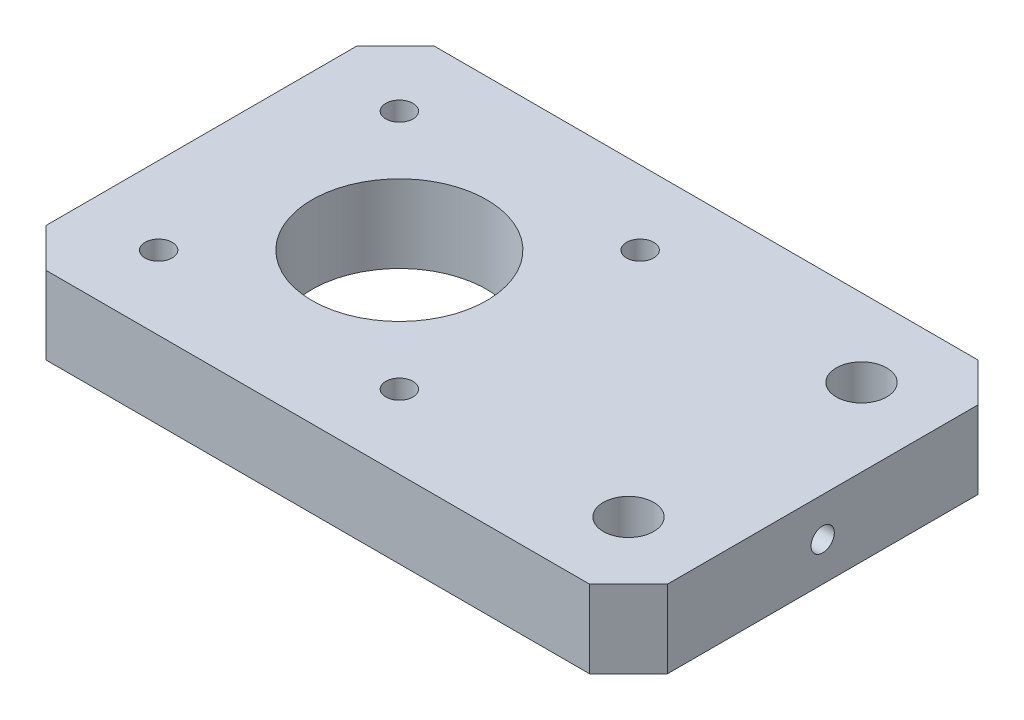
ISO-10303-21;
HEADER;
FILE_DESCRIPTION(('STEP AP214'),'2;1');
FILE_NAME('part.step','',(''),(''),'','','');
FILE_SCHEMA(('AUTOMOTIVE_DESIGN { 1 0 10303 214 1 1 1 1 }'));
ENDSEC;
DATA;
#1=APPLICATION_CONTEXT('core data for automotive mechanical design processes');
#2=APPLICATION_PROTOCOL_DEFINITION('international standard','automotive_design',2000,#1);
#3=PRODUCT_CONTEXT('',#1,'mechanical');
#4=PRODUCT('Part','Part','',(#3));
#5=PRODUCT_RELATED_PRODUCT_CATEGORY('part','',(#4));
#6=PRODUCT_DEFINITION_FORMATION('','',#4);
#7=PRODUCT_DEFINITION_CONTEXT('part definition',#1,'design');
#8=PRODUCT_DEFINITION('design','',#6,#7);
#9=PRODUCT_DEFINITION_SHAPE('','',#8);
#10=(LENGTH_UNIT() NAMED_UNIT(*) SI_UNIT(.MILLI.,.METRE.));
#11=(NAMED_UNIT(*) PLANE_ANGLE_UNIT() SI_UNIT($,.RADIAN.));
#12=(NAMED_UNIT(*) SI_UNIT($,.STERADIAN.) SOLID_ANGLE_UNIT());
#13=UNCERTAINTY_MEASURE_WITH_UNIT(LENGTH_MEASURE(1.E-05),#10,'distance_accuracy_value','');
#14=(GEOMETRIC_REPRESENTATION_CONTEXT(3) GLOBAL_UNCERTAINTY_ASSIGNED_CONTEXT((#13)) GLOBAL_UNIT_ASSIGNED_CONTEXT((#10,
#11,#12)) REPRESENTATION_CONTEXT('',''));
#15=CARTESIAN_POINT('',(0.,0.,0.));
#16=DIRECTION('',(0.,0.,1.));
#17=DIRECTION('',(1.,0.,0.));
#18=AXIS2_PLACEMENT_3D('',#15,#16,#17);
#19=CARTESIAN_POINT('',(0.,10.,25.));
#20=DIRECTION('',(0.,1.,0.));
#21=DIRECTION('',(0.,0.,1.));
#22=AXIS2_PLACEMENT_3D('',#19,#20,#21);
#23=PLANE('',#22);
#24=CARTESIAN_POINT('',(70.,10.,-15.));
#25=DIRECTION('',(0.,1.,0.));
#26=DIRECTION('',(0.,0.,1.));
#27=AXIS2_PLACEMENT_3D('',#24,#25,#26);
#28=CIRCLE('',#27,3.25000000000001);
#29=CARTESIAN_POINT('',(70.,10.,-11.75));
#30=VERTEX_POINT('',#29);
#31=EDGE_CURVE('E202',#30,#30,#28,.T.);
#32=ORIENTED_EDGE('',*,*,#31,.F.);
#33=EDGE_LOOP('',(#32));
#34=FACE_BOUND('',#33,.T.);
#35=CARTESIAN_POINT('',(41.,10.,-15.5));
#36=DIRECTION('',(0.,1.,0.));
#37=DIRECTION('',(0.,0.,1.));
#38=AXIS2_PLACEMENT_3D('',#35,#36,#37);
#39=CIRCLE('',#38,1.75);
#40=CARTESIAN_POINT('',(41.,10.,-13.75));
#41=VERTEX_POINT('',#40);
#42=EDGE_CURVE('E190',#41,#41,#39,.T.);
#43=ORIENTED_EDGE('',*,*,#42,.F.);
#44=EDGE_LOOP('',(#43));
#45=FACE_BOUND('',#44,.T.);
#46=CARTESIAN_POINT('',(10.,10.,15.5));
#47=DIRECTION('',(0.,1.,0.));
#48=DIRECTION('',(0.,0.,1.));
#49=AXIS2_PLACEMENT_3D('',#46,#47,#48);
#50=CIRCLE('',#49,1.75);
#51=CARTESIAN_POINT('',(10.,10.,17.25));
#52=VERTEX_POINT('',#51);
#53=EDGE_CURVE('E178',#52,#52,#50,.T.);
#54=ORIENTED_EDGE('',*,*,#53,.F.);
#55=EDGE_LOOP('',(#54));
#56=FACE_BOUND('',#55,.T.);
#57=DIRECTION('',(0.,0.,1.));
#58=VECTOR('',#57,1.);
#59=CARTESIAN_POINT('',(0.,10.,-25.));
#60=LINE('',#59,#58);
#61=CARTESIAN_POINT('',(0.,10.,-20.));
#62=VERTEX_POINT('',#61);
#63=CARTESIAN_POINT('',(0.,10.,20.));
#64=VERTEX_POINT('',#63);
#65=EDGE_CURVE('E135',#62,#64,#60,.T.);
#66=ORIENTED_EDGE('',*,*,#65,.T.);
#67=DIRECTION('',(-0.707106781186547,0.,-0.707106781186549));
#68=VECTOR('',#67,1.);
#69=CARTESIAN_POINT('',(2.50000000000002,10.,22.5));
#70=LINE('',#69,#68);
#71=CARTESIAN_POINT('',(5.00000000000002,10.,25.));
#72=VERTEX_POINT('',#71);
#73=EDGE_CURVE('E150',#64,#72,#70,.F.);
#74=ORIENTED_EDGE('',*,*,#73,.T.);
#75=DIRECTION('',(1.,0.,0.));
#76=VECTOR('',#75,1.);
#77=CARTESIAN_POINT('',(0.,10.,25.));
#78=LINE('',#77,#76);
#79=CARTESIAN_POINT('',(75.,10.,25.));
#80=VERTEX_POINT('',#79);
#81=EDGE_CURVE('E117',#72,#80,#78,.T.);
#82=ORIENTED_EDGE('',*,*,#81,.T.);
#83=DIRECTION('',(-0.707106781186549,0.,0.707106781186546));
#84=VECTOR('',#83,1.);
#85=CARTESIAN_POINT('',(37.4999999999998,10.,62.5));
#86=LINE('',#85,#84);
#87=CARTESIAN_POINT('',(80.,10.,20.));
#88=VERTEX_POINT('',#87);
#89=EDGE_CURVE('E145',#80,#88,#86,.F.);
#90=ORIENTED_EDGE('',*,*,#89,.T.);
#91=DIRECTION('',(0.,0.,-1.));
#92=VECTOR('',#91,1.);
#93=CARTESIAN_POINT('',(80.,10.,-25.));
#94=LINE('',#93,#92);
#95=CARTESIAN_POINT('',(80.,10.,-20.));
#96=VERTEX_POINT('',#95);
#97=EDGE_CURVE('E161',#88,#96,#94,.T.);
#98=ORIENTED_EDGE('',*,*,#97,.T.);
#99=DIRECTION('',(0.707106781186547,0.,0.707106781186549));
#100=VECTOR('',#99,1.);
#101=CARTESIAN_POINT('',(62.5000000000001,10.,-37.4999999999999));
#102=LINE('',#101,#100);
#103=CARTESIAN_POINT('',(75.,10.,-25.));
#104=VERTEX_POINT('',#103);
#105=EDGE_CURVE('E53',#96,#104,#102,.F.);
#106=ORIENTED_EDGE('',*,*,#105,.T.);
#107=DIRECTION('',(-1.,0.,0.));
#108=VECTOR('',#107,1.);
#109=CARTESIAN_POINT('',(0.,10.,-25.));
#110=LINE('',#109,#108);
#111=CARTESIAN_POINT('',(5.00000000000003,10.,-25.));
#112=VERTEX_POINT('',#111);
#113=EDGE_CURVE('E136',#104,#112,#110,.T.);
#114=ORIENTED_EDGE('',*,*,#113,.T.);
#115=DIRECTION('',(0.707106781186549,0.,-0.707106781186546));
#116=VECTOR('',#115,1.);
#117=CARTESIAN_POINT('',(-22.5,10.,2.49999999999988));
#118=LINE('',#117,#116);
#119=EDGE_CURVE('E148',#112,#62,#118,.F.);
#120=ORIENTED_EDGE('',*,*,#119,.T.);
#121=EDGE_LOOP('',(#66,#74,#82,#90,#98,#106,#114,#120));
#122=FACE_BOUND('',#121,.T.);
#123=CARTESIAN_POINT('',(10.,10.,-15.5));
#124=DIRECTION('',(0.,1.,0.));
#125=DIRECTION('',(0.,0.,1.));
#126=AXIS2_PLACEMENT_3D('',#123,#124,#125);
#127=CIRCLE('',#126,1.75);
#128=CARTESIAN_POINT('',(10.,10.,-13.75));
#129=VERTEX_POINT('',#128);
#130=EDGE_CURVE('E130',#129,#129,#127,.T.);
#131=ORIENTED_EDGE('',*,*,#130,.F.);
#132=EDGE_LOOP('',(#131));
#133=FACE_BOUND('',#132,.T.);
#134=CARTESIAN_POINT('',(25.5,10.,0.));
#135=DIRECTION('',(0.,1.,0.));
#136=DIRECTION('',(0.,0.,1.));
#137=AXIS2_PLACEMENT_3D('',#134,#135,#136);
#138=CIRCLE('',#137,11.25);
#139=CARTESIAN_POINT('',(25.5,10.,11.25));
#140=VERTEX_POINT('',#139);
#141=EDGE_CURVE('E184',#140,#140,#138,.T.);
#142=ORIENTED_EDGE('',*,*,#141,.F.);
#143=EDGE_LOOP('',(#142));
#144=FACE_BOUND('',#143,.T.);
#145=CARTESIAN_POINT('',(41.,10.,15.5));
#146=DIRECTION('',(0.,1.,0.));
#147=DIRECTION('',(0.,0.,1.));
#148=AXIS2_PLACEMENT_3D('',#145,#146,#147);
#149=CIRCLE('',#148,1.75);
#150=CARTESIAN_POINT('',(41.,10.,17.25));
#151=VERTEX_POINT('',#150);
#152=EDGE_CURVE('E196',#151,#151,#149,.T.);
#153=ORIENTED_EDGE('',*,*,#152,.F.);
#154=EDGE_LOOP('',(#153));
#155=FACE_BOUND('',#154,.T.);
#156=CARTESIAN_POINT('',(70.,10.,15.));
#157=DIRECTION('',(0.,1.,0.));
#158=DIRECTION('',(0.,0.,1.));
#159=AXIS2_PLACEMENT_3D('',#156,#157,#158);
#160=CIRCLE('',#159,3.25000000000001);
#161=CARTESIAN_POINT('',(70.,10.,18.25));
#162=VERTEX_POINT('',#161);
#163=EDGE_CURVE('E208',#162,#162,#160,.T.);
#164=ORIENTED_EDGE('',*,*,#163,.F.);
#165=EDGE_LOOP('',(#164));
#166=FACE_BOUND('',#165,.T.);
#167=ADVANCED_FACE('F31',(#34,#45,#56,#122,#133,#144,#155,#166),#23,.T.);
#168=CARTESIAN_POINT('',(0.,0.,25.));
#169=DIRECTION('',(0.,1.,0.));
#170=DIRECTION('',(0.,0.,1.));
#171=AXIS2_PLACEMENT_3D('',#168,#169,#170);
#172=PLANE('',#171);
#173=CARTESIAN_POINT('',(70.,0.,-15.));
#174=DIRECTION('',(0.,1.,0.));
#175=DIRECTION('',(0.,0.,1.));
#176=AXIS2_PLACEMENT_3D('',#173,#174,#175);
#177=CIRCLE('',#176,3.25000000000001);
#178=CARTESIAN_POINT('',(70.,0.,-11.75));
#179=VERTEX_POINT('',#178);
#180=EDGE_CURVE('E205',#179,#179,#177,.T.);
#181=ORIENTED_EDGE('',*,*,#180,.T.);
#182=EDGE_LOOP('',(#181));
#183=FACE_BOUND('',#182,.T.);
#184=CARTESIAN_POINT('',(41.,0.,-15.5));
#185=DIRECTION('',(0.,1.,0.));
#186=DIRECTION('',(0.,0.,1.));
#187=AXIS2_PLACEMENT_3D('',#184,#185,#186);
#188=CIRCLE('',#187,1.75);
#189=CARTESIAN_POINT('',(41.,0.,-13.75));
#190=VERTEX_POINT('',#189);
#191=EDGE_CURVE('E193',#190,#190,#188,.T.);
#192=ORIENTED_EDGE('',*,*,#191,.T.);
#193=EDGE_LOOP('',(#192));
#194=FACE_BOUND('',#193,.T.);
#195=CARTESIAN_POINT('',(10.,0.,15.5));
#196=DIRECTION('',(0.,1.,0.));
#197=DIRECTION('',(0.,0.,1.));
#198=AXIS2_PLACEMENT_3D('',#195,#196,#197);
#199=CIRCLE('',#198,1.75);
#200=CARTESIAN_POINT('',(10.,0.,17.25));
#201=VERTEX_POINT('',#200);
#202=EDGE_CURVE('E181',#201,#201,#199,.T.);
#203=ORIENTED_EDGE('',*,*,#202,.T.);
#204=EDGE_LOOP('',(#203));
#205=FACE_BOUND('',#204,.T.);
#206=DIRECTION('',(1.,0.,0.));
#207=VECTOR('',#206,1.);
#208=CARTESIAN_POINT('',(0.,0.,25.));
#209=LINE('',#208,#207);
#210=CARTESIAN_POINT('',(5.00000000000002,0.,25.));
#211=VERTEX_POINT('',#210);
#212=CARTESIAN_POINT('',(75.,0.,25.));
#213=VERTEX_POINT('',#212);
#214=EDGE_CURVE('E114',#211,#213,#209,.T.);
#215=ORIENTED_EDGE('',*,*,#214,.F.);
#216=DIRECTION('',(0.707106781186547,0.,0.707106781186549));
#217=VECTOR('',#216,1.);
#218=CARTESIAN_POINT('',(5.00000000000002,0.,25.));
#219=LINE('',#218,#217);
#220=CARTESIAN_POINT('',(0.,0.,20.));
#221=VERTEX_POINT('',#220);
#222=EDGE_CURVE('E97',#211,#221,#219,.F.);
#223=ORIENTED_EDGE('',*,*,#222,.T.);
#224=DIRECTION('',(0.,0.,1.));
#225=VECTOR('',#224,1.);
#226=CARTESIAN_POINT('',(0.,0.,-25.));
#227=LINE('',#226,#225);
#228=CARTESIAN_POINT('',(0.,0.,-20.));
#229=VERTEX_POINT('',#228);
#230=EDGE_CURVE('E125',#229,#221,#227,.T.);
#231=ORIENTED_EDGE('',*,*,#230,.F.);
#232=DIRECTION('',(-0.707106781186549,0.,0.707106781186546));
#233=VECTOR('',#232,1.);
#234=CARTESIAN_POINT('',(0.,0.,-20.));
#235=LINE('',#234,#233);
#236=CARTESIAN_POINT('',(5.00000000000004,0.,-25.));
#237=VERTEX_POINT('',#236);
#238=EDGE_CURVE('E108',#229,#237,#235,.F.);
#239=ORIENTED_EDGE('',*,*,#238,.T.);
#240=DIRECTION('',(-1.,0.,0.));
#241=VECTOR('',#240,1.);
#242=CARTESIAN_POINT('',(0.,0.,-25.));
#243=LINE('',#242,#241);
#244=CARTESIAN_POINT('',(75.,0.,-25.));
#245=VERTEX_POINT('',#244);
#246=EDGE_CURVE('E128',#245,#237,#243,.T.);
#247=ORIENTED_EDGE('',*,*,#246,.F.);
#248=DIRECTION('',(-0.707106781186547,0.,-0.707106781186549));
#249=VECTOR('',#248,1.);
#250=CARTESIAN_POINT('',(75.,0.,-25.));
#251=LINE('',#250,#249);
#252=CARTESIAN_POINT('',(80.,0.,-20.));
#253=VERTEX_POINT('',#252);
#254=EDGE_CURVE('E139',#245,#253,#251,.F.);
#255=ORIENTED_EDGE('',*,*,#254,.T.);
#256=DIRECTION('',(0.,0.,-1.));
#257=VECTOR('',#256,1.);
#258=CARTESIAN_POINT('',(80.,0.,-25.));
#259=LINE('',#258,#257);
#260=CARTESIAN_POINT('',(80.,0.,20.));
#261=VERTEX_POINT('',#260);
#262=EDGE_CURVE('E124',#261,#253,#259,.T.);
#263=ORIENTED_EDGE('',*,*,#262,.F.);
#264=DIRECTION('',(0.707106781186549,0.,-0.707106781186546));
#265=VECTOR('',#264,1.);
#266=CARTESIAN_POINT('',(80.,0.,20.));
#267=LINE('',#266,#265);
#268=EDGE_CURVE('E118',#261,#213,#267,.F.);
#269=ORIENTED_EDGE('',*,*,#268,.T.);
#270=EDGE_LOOP('',(#215,#223,#231,#239,#247,#255,#263,#269));
#271=FACE_BOUND('',#270,.T.);
#272=CARTESIAN_POINT('',(10.,0.,-15.5));
#273=DIRECTION('',(0.,1.,0.));
#274=DIRECTION('',(0.,0.,1.));
#275=AXIS2_PLACEMENT_3D('',#272,#273,#274);
#276=CIRCLE('',#275,1.75);
#277=CARTESIAN_POINT('',(10.,0.,-13.75));
#278=VERTEX_POINT('',#277);
#279=EDGE_CURVE('E175',#278,#278,#276,.T.);
#280=ORIENTED_EDGE('',*,*,#279,.T.);
#281=EDGE_LOOP('',(#280));
#282=FACE_BOUND('',#281,.T.);
#283=CARTESIAN_POINT('',(25.5,0.,0.));
#284=DIRECTION('',(0.,1.,0.));
#285=DIRECTION('',(0.,0.,1.));
#286=AXIS2_PLACEMENT_3D('',#283,#284,#285);
#287=CIRCLE('',#286,11.25);
#288=CARTESIAN_POINT('',(25.5,0.,11.25));
#289=VERTEX_POINT('',#288);
#290=EDGE_CURVE('E187',#289,#289,#287,.T.);
#291=ORIENTED_EDGE('',*,*,#290,.T.);
#292=EDGE_LOOP('',(#291));
#293=FACE_BOUND('',#292,.T.);
#294=CARTESIAN_POINT('',(41.,0.,15.5));
#295=DIRECTION('',(0.,1.,0.));
#296=DIRECTION('',(0.,0.,1.));
#297=AXIS2_PLACEMENT_3D('',#294,#295,#296);
#298=CIRCLE('',#297,1.75);
#299=CARTESIAN_POINT('',(41.,0.,17.25));
#300=VERTEX_POINT('',#299);
#301=EDGE_CURVE('E199',#300,#300,#298,.T.);
#302=ORIENTED_EDGE('',*,*,#301,.T.);
#303=EDGE_LOOP('',(#302));
#304=FACE_BOUND('',#303,.T.);
#305=CARTESIAN_POINT('',(70.,0.,15.));
#306=DIRECTION('',(0.,1.,0.));
#307=DIRECTION('',(0.,0.,1.));
#308=AXIS2_PLACEMENT_3D('',#305,#306,#307);
#309=CIRCLE('',#308,3.25000000000001);
#310=CARTESIAN_POINT('',(70.,0.,18.25));
#311=VERTEX_POINT('',#310);
#312=EDGE_CURVE('E211',#311,#311,#309,.T.);
#313=ORIENTED_EDGE('',*,*,#312,.T.);
#314=EDGE_LOOP('',(#313));
#315=FACE_BOUND('',#314,.T.);
#316=ADVANCED_FACE('F121',(#183,#194,#205,#271,#282,#293,#304,#315),#172,.F.);
#317=CARTESIAN_POINT('',(0.,10.,-25.));
#318=DIRECTION('',(1.,0.,0.));
#319=DIRECTION('',(0.,0.,-1.));
#320=AXIS2_PLACEMENT_3D('',#317,#318,#319);
#321=PLANE('',#320);
#322=ORIENTED_EDGE('',*,*,#230,.T.);
#323=DIRECTION('',(0.,1.,0.));
#324=VECTOR('',#323,1.);
#325=CARTESIAN_POINT('',(0.,10.,20.));
#326=LINE('',#325,#324);
#327=EDGE_CURVE('E102',#221,#64,#326,.T.);
#328=ORIENTED_EDGE('',*,*,#327,.T.);
#329=ORIENTED_EDGE('',*,*,#65,.F.);
#330=DIRECTION('',(0.,-1.,0.));
#331=VECTOR('',#330,1.);
#332=CARTESIAN_POINT('',(0.,10.,-20.));
#333=LINE('',#332,#331);
#334=EDGE_CURVE('E107',#62,#229,#333,.T.);
#335=ORIENTED_EDGE('',*,*,#334,.T.);
#336=EDGE_LOOP('',(#322,#328,#329,#335));
#337=FACE_BOUND('',#336,.T.);
#338=ADVANCED_FACE('F240',(#337),#321,.F.);
#339=CARTESIAN_POINT('',(0.,10.,25.));
#340=DIRECTION('',(0.,0.,-1.));
#341=DIRECTION('',(-1.,0.,0.));
#342=AXIS2_PLACEMENT_3D('',#339,#340,#341);
#343=PLANE('',#342);
#344=ORIENTED_EDGE('',*,*,#81,.F.);
#345=DIRECTION('',(0.,-1.,0.));
#346=VECTOR('',#345,1.);
#347=CARTESIAN_POINT('',(5.00000000000002,10.,25.));
#348=LINE('',#347,#346);
#349=EDGE_CURVE('E101',#72,#211,#348,.T.);
#350=ORIENTED_EDGE('',*,*,#349,.T.);
#351=ORIENTED_EDGE('',*,*,#214,.T.);
#352=DIRECTION('',(0.,1.,0.));
#353=VECTOR('',#352,1.);
#354=CARTESIAN_POINT('',(75.,10.,25.));
#355=LINE('',#354,#353);
#356=EDGE_CURVE('E119',#213,#80,#355,.T.);
#357=ORIENTED_EDGE('',*,*,#356,.T.);
#358=EDGE_LOOP('',(#344,#350,#351,#357));
#359=FACE_BOUND('',#358,.T.);
#360=ADVANCED_FACE('F113',(#359),#343,.F.);
#361=CARTESIAN_POINT('',(80.,10.,-25.));
#362=DIRECTION('',(-1.,0.,0.));
#363=DIRECTION('',(0.,0.,1.));
#364=AXIS2_PLACEMENT_3D('',#361,#362,#363);
#365=PLANE('',#364);
#366=CARTESIAN_POINT('',(80.,5.,0.));
#367=DIRECTION('',(1.,0.,0.));
#368=DIRECTION('',(0.,0.,-1.));
#369=AXIS2_PLACEMENT_3D('',#366,#367,#368);
#370=CIRCLE('',#369,1.5);
#371=CARTESIAN_POINT('',(80.,5.,-1.5));
#372=VERTEX_POINT('',#371);
#373=EDGE_CURVE('E217',#372,#372,#370,.T.);
#374=ORIENTED_EDGE('',*,*,#373,.F.);
#375=EDGE_LOOP('',(#374));
#376=FACE_BOUND('',#375,.T.);
#377=ORIENTED_EDGE('',*,*,#262,.T.);
#378=DIRECTION('',(0.,1.,0.));
#379=VECTOR('',#378,1.);
#380=CARTESIAN_POINT('',(80.,10.,-20.));
#381=LINE('',#380,#379);
#382=EDGE_CURVE('E11',#253,#96,#381,.T.);
#383=ORIENTED_EDGE('',*,*,#382,.T.);
#384=ORIENTED_EDGE('',*,*,#97,.F.);
#385=DIRECTION('',(0.,-1.,0.));
#386=VECTOR('',#385,1.);
#387=CARTESIAN_POINT('',(80.,10.,20.));
#388=LINE('',#387,#386);
#389=EDGE_CURVE('E39',#88,#261,#388,.T.);
#390=ORIENTED_EDGE('',*,*,#389,.T.);
#391=EDGE_LOOP('',(#377,#383,#384,#390));
#392=FACE_BOUND('',#391,.T.);
#393=ADVANCED_FACE('F159',(#376,#392),#365,.F.);
#394=CARTESIAN_POINT('',(0.,10.,-25.));
#395=DIRECTION('',(0.,0.,1.));
#396=DIRECTION('',(1.,0.,0.));
#397=AXIS2_PLACEMENT_3D('',#394,#395,#396);
#398=PLANE('',#397);
#399=ORIENTED_EDGE('',*,*,#246,.T.);
#400=DIRECTION('',(0.,1.,0.));
#401=VECTOR('',#400,1.);
#402=CARTESIAN_POINT('',(5.00000000000004,10.,-25.));
#403=LINE('',#402,#401);
#404=EDGE_CURVE('E46',#237,#112,#403,.T.);
#405=ORIENTED_EDGE('',*,*,#404,.T.);
#406=ORIENTED_EDGE('',*,*,#113,.F.);
#407=DIRECTION('',(0.,-1.,0.));
#408=VECTOR('',#407,1.);
#409=CARTESIAN_POINT('',(75.,10.,-25.));
#410=LINE('',#409,#408);
#411=EDGE_CURVE('E152',#104,#245,#410,.T.);
#412=ORIENTED_EDGE('',*,*,#411,.T.);
#413=EDGE_LOOP('',(#399,#405,#406,#412));
#414=FACE_BOUND('',#413,.T.);
#415=ADVANCED_FACE('F168',(#414),#398,.F.);
#416=CARTESIAN_POINT('',(10.,10.,-15.5));
#417=DIRECTION('',(0.,-1.,0.));
#418=DIRECTION('',(0.,0.,-1.));
#419=AXIS2_PLACEMENT_3D('',#416,#417,#418);
#420=CYLINDRICAL_SURFACE('',#419,1.75);
#421=ORIENTED_EDGE('',*,*,#130,.T.);
#422=EDGE_LOOP('',(#421));
#423=FACE_BOUND('',#422,.T.);
#424=ORIENTED_EDGE('',*,*,#279,.F.);
#425=EDGE_LOOP('',(#424));
#426=FACE_BOUND('',#425,.T.);
#427=ADVANCED_FACE('F238',(#423,#426),#420,.F.);
#428=CARTESIAN_POINT('',(10.,10.,15.5));
#429=DIRECTION('',(0.,-1.,0.));
#430=DIRECTION('',(0.,0.,-1.));
#431=AXIS2_PLACEMENT_3D('',#428,#429,#430);
#432=CYLINDRICAL_SURFACE('',#431,1.75);
#433=ORIENTED_EDGE('',*,*,#53,.T.);
#434=EDGE_LOOP('',(#433));
#435=FACE_BOUND('',#434,.T.);
#436=ORIENTED_EDGE('',*,*,#202,.F.);
#437=EDGE_LOOP('',(#436));
#438=FACE_BOUND('',#437,.T.);
#439=ADVANCED_FACE('F255',(#435,#438),#432,.F.);
#440=CARTESIAN_POINT('',(25.5,10.,0.));
#441=DIRECTION('',(0.,-1.,0.));
#442=DIRECTION('',(0.,0.,-1.));
#443=AXIS2_PLACEMENT_3D('',#440,#441,#442);
#444=CYLINDRICAL_SURFACE('',#443,11.25);
#445=ORIENTED_EDGE('',*,*,#141,.T.);
#446=EDGE_LOOP('',(#445));
#447=FACE_BOUND('',#446,.T.);
#448=ORIENTED_EDGE('',*,*,#290,.F.);
#449=EDGE_LOOP('',(#448));
#450=FACE_BOUND('',#449,.T.);
#451=ADVANCED_FACE('F259',(#447,#450),#444,.F.);
#452=CARTESIAN_POINT('',(41.,10.,-15.5));
#453=DIRECTION('',(0.,-1.,0.));
#454=DIRECTION('',(0.,0.,-1.));
#455=AXIS2_PLACEMENT_3D('',#452,#453,#454);
#456=CYLINDRICAL_SURFACE('',#455,1.75);
#457=ORIENTED_EDGE('',*,*,#42,.T.);
#458=EDGE_LOOP('',(#457));
#459=FACE_BOUND('',#458,.T.);
#460=ORIENTED_EDGE('',*,*,#191,.F.);
#461=EDGE_LOOP('',(#460));
#462=FACE_BOUND('',#461,.T.);
#463=ADVANCED_FACE('F263',(#459,#462),#456,.F.);
#464=CARTESIAN_POINT('',(41.,10.,15.5));
#465=DIRECTION('',(0.,-1.,0.));
#466=DIRECTION('',(0.,0.,-1.));
#467=AXIS2_PLACEMENT_3D('',#464,#465,#466);
#468=CYLINDRICAL_SURFACE('',#467,1.75);
#469=ORIENTED_EDGE('',*,*,#152,.T.);
#470=EDGE_LOOP('',(#469));
#471=FACE_BOUND('',#470,.T.);
#472=ORIENTED_EDGE('',*,*,#301,.F.);
#473=EDGE_LOOP('',(#472));
#474=FACE_BOUND('',#473,.T.);
#475=ADVANCED_FACE('F267',(#471,#474),#468,.F.);
#476=CARTESIAN_POINT('',(70.,10.,-15.));
#477=DIRECTION('',(0.,-1.,0.));
#478=DIRECTION('',(0.,0.,-1.));
#479=AXIS2_PLACEMENT_3D('',#476,#477,#478);
#480=CYLINDRICAL_SURFACE('',#479,3.25000000000001);
#481=ORIENTED_EDGE('',*,*,#31,.T.);
#482=EDGE_LOOP('',(#481));
#483=FACE_BOUND('',#482,.T.);
#484=ORIENTED_EDGE('',*,*,#180,.F.);
#485=EDGE_LOOP('',(#484));
#486=FACE_BOUND('',#485,.T.);
#487=ADVANCED_FACE('F271',(#483,#486),#480,.F.);
#488=CARTESIAN_POINT('',(70.,10.,15.));
#489=DIRECTION('',(0.,-1.,0.));
#490=DIRECTION('',(0.,0.,-1.));
#491=AXIS2_PLACEMENT_3D('',#488,#489,#490);
#492=CYLINDRICAL_SURFACE('',#491,3.25000000000001);
#493=ORIENTED_EDGE('',*,*,#163,.T.);
#494=EDGE_LOOP('',(#493));
#495=FACE_BOUND('',#494,.T.);
#496=ORIENTED_EDGE('',*,*,#312,.F.);
#497=EDGE_LOOP('',(#496));
#498=FACE_BOUND('',#497,.T.);
#499=ADVANCED_FACE('F228',(#495,#498),#492,.F.);
#500=CARTESIAN_POINT('',(65.,5.,0.));
#501=DIRECTION('',(1.,0.,0.));
#502=DIRECTION('',(0.,0.,-1.));
#503=AXIS2_PLACEMENT_3D('',#500,#501,#502);
#504=CYLINDRICAL_SURFACE('',#503,1.5);
#505=CARTESIAN_POINT('',(65.,5.,0.));
#506=DIRECTION('',(1.,0.,0.));
#507=DIRECTION('',(0.,0.,-1.));
#508=AXIS2_PLACEMENT_3D('',#505,#506,#507);
#509=CIRCLE('',#508,1.5);
#510=CARTESIAN_POINT('',(65.,5.,-1.5));
#511=VERTEX_POINT('',#510);
#512=EDGE_CURVE('E214',#511,#511,#509,.T.);
#513=ORIENTED_EDGE('',*,*,#512,.F.);
#514=EDGE_LOOP('',(#513));
#515=FACE_BOUND('',#514,.T.);
#516=ORIENTED_EDGE('',*,*,#373,.T.);
#517=EDGE_LOOP('',(#516));
#518=FACE_BOUND('',#517,.T.);
#519=ADVANCED_FACE('F225',(#515,#518),#504,.F.);
#520=CARTESIAN_POINT('',(65.,5.,0.));
#521=DIRECTION('',(1.,0.,0.));
#522=DIRECTION('',(0.,0.,-1.));
#523=AXIS2_PLACEMENT_3D('',#520,#521,#522);
#524=PLANE('',#523);
#525=ORIENTED_EDGE('',*,*,#512,.T.);
#526=EDGE_LOOP('',(#525));
#527=FACE_BOUND('',#526,.T.);
#528=ADVANCED_FACE('F223',(#527),#524,.T.);
#529=CARTESIAN_POINT('',(5.00000000000002,10.,25.));
#530=DIRECTION('',(0.707106781186548,0.,-0.707106781186546));
#531=DIRECTION('',(-0.707106781186547,0.,-0.707106781186549));
#532=AXIS2_PLACEMENT_3D('',#529,#530,#531);
#533=PLANE('',#532);
#534=ORIENTED_EDGE('',*,*,#73,.F.);
#535=ORIENTED_EDGE('',*,*,#327,.F.);
#536=ORIENTED_EDGE('',*,*,#222,.F.);
#537=ORIENTED_EDGE('',*,*,#349,.F.);
#538=EDGE_LOOP('',(#534,#535,#536,#537));
#539=FACE_BOUND('',#538,.T.);
#540=ADVANCED_FACE('F100',(#539),#533,.F.);
#541=CARTESIAN_POINT('',(0.,10.,-20.));
#542=DIRECTION('',(0.707106781186545,0.,0.707106781186549));
#543=DIRECTION('',(0.707106781186549,0.,-0.707106781186546));
#544=AXIS2_PLACEMENT_3D('',#541,#542,#543);
#545=PLANE('',#544);
#546=ORIENTED_EDGE('',*,*,#119,.F.);
#547=ORIENTED_EDGE('',*,*,#404,.F.);
#548=ORIENTED_EDGE('',*,*,#238,.F.);
#549=ORIENTED_EDGE('',*,*,#334,.F.);
#550=EDGE_LOOP('',(#546,#547,#548,#549));
#551=FACE_BOUND('',#550,.T.);
#552=ADVANCED_FACE('F283',(#551),#545,.F.);
#553=CARTESIAN_POINT('',(75.,10.,-25.));
#554=DIRECTION('',(-0.707106781186549,0.,0.707106781186547));
#555=DIRECTION('',(0.707106781186547,0.,0.707106781186549));
#556=AXIS2_PLACEMENT_3D('',#553,#554,#555);
#557=PLANE('',#556);
#558=ORIENTED_EDGE('',*,*,#105,.F.);
#559=ORIENTED_EDGE('',*,*,#382,.F.);
#560=ORIENTED_EDGE('',*,*,#254,.F.);
#561=ORIENTED_EDGE('',*,*,#411,.F.);
#562=EDGE_LOOP('',(#558,#559,#560,#561));
#563=FACE_BOUND('',#562,.T.);
#564=ADVANCED_FACE('F167',(#563),#557,.F.);
#565=CARTESIAN_POINT('',(80.,10.,20.));
#566=DIRECTION('',(-0.707106781186545,0.,-0.707106781186549));
#567=DIRECTION('',(-0.707106781186549,0.,0.707106781186546));
#568=AXIS2_PLACEMENT_3D('',#565,#566,#567);
#569=PLANE('',#568);
#570=ORIENTED_EDGE('',*,*,#89,.F.);
#571=ORIENTED_EDGE('',*,*,#356,.F.);
#572=ORIENTED_EDGE('',*,*,#268,.F.);
#573=ORIENTED_EDGE('',*,*,#389,.F.);
#574=EDGE_LOOP('',(#570,#571,#572,#573));
#575=FACE_BOUND('',#574,.T.);
#576=ADVANCED_FACE('F33',(#575),#569,.F.);
#577=CLOSED_SHELL('',(#167,#316,#338,#360,#393,#415,#427,#439,#451,#463,#475,#487,#499,#519,
#528,#540,#552,#564,#576));
#578=MANIFOLD_SOLID_BREP('B2',#577);
#579=ADVANCED_BREP_SHAPE_REPRESENTATION('',(#18,#578),#14);
#580=SHAPE_DEFINITION_REPRESENTATION(#9,#579);
ENDSEC;
END-ISO-10303-21;
